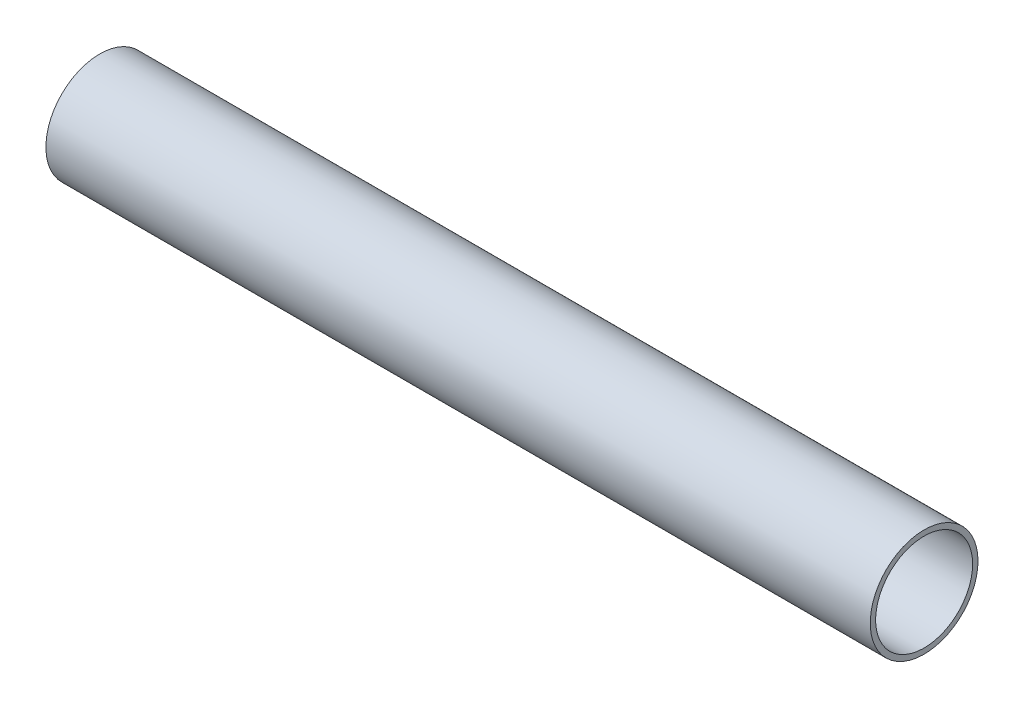
ISO-10303-21;
HEADER;
FILE_DESCRIPTION(('STEP AP214'),'2;1');
FILE_NAME('part.step','',(''),(''),'','','');
FILE_SCHEMA(('AUTOMOTIVE_DESIGN { 1 0 10303 214 1 1 1 1 }'));
ENDSEC;
DATA;
#1=APPLICATION_CONTEXT('core data for automotive mechanical design processes');
#2=APPLICATION_PROTOCOL_DEFINITION('international standard','automotive_design',2000,#1);
#3=PRODUCT_CONTEXT('',#1,'mechanical');
#4=PRODUCT('Part','Part','',(#3));
#5=PRODUCT_RELATED_PRODUCT_CATEGORY('part','',(#4));
#6=PRODUCT_DEFINITION_FORMATION('','',#4);
#7=PRODUCT_DEFINITION_CONTEXT('part definition',#1,'design');
#8=PRODUCT_DEFINITION('design','',#6,#7);
#9=PRODUCT_DEFINITION_SHAPE('','',#8);
#10=(LENGTH_UNIT() NAMED_UNIT(*) SI_UNIT(.MILLI.,.METRE.));
#11=(NAMED_UNIT(*) PLANE_ANGLE_UNIT() SI_UNIT($,.RADIAN.));
#12=(NAMED_UNIT(*) SI_UNIT($,.STERADIAN.) SOLID_ANGLE_UNIT());
#13=UNCERTAINTY_MEASURE_WITH_UNIT(LENGTH_MEASURE(1.E-05),#10,'distance_accuracy_value','');
#14=(GEOMETRIC_REPRESENTATION_CONTEXT(3) GLOBAL_UNCERTAINTY_ASSIGNED_CONTEXT((#13)) GLOBAL_UNIT_ASSIGNED_CONTEXT((#10,
#11,#12)) REPRESENTATION_CONTEXT('',''));
#15=CARTESIAN_POINT('',(0.,0.,0.));
#16=DIRECTION('',(0.,0.,1.));
#17=DIRECTION('',(1.,0.,0.));
#18=AXIS2_PLACEMENT_3D('',#15,#16,#17);
#19=CARTESIAN_POINT('',(140.019255902,0.,0.));
#20=DIRECTION('',(-1.,0.,0.));
#21=DIRECTION('',(0.,0.,1.));
#22=AXIS2_PLACEMENT_3D('',#19,#20,#21);
#23=CYLINDRICAL_SURFACE('',#22,14.2875);
#24=CARTESIAN_POINT('',(-102.8953111,0.,0.));
#25=DIRECTION('',(1.,0.,0.));
#26=DIRECTION('',(0.,0.,-1.));
#27=AXIS2_PLACEMENT_3D('',#24,#25,#26);
#28=CIRCLE('',#27,14.2875);
#29=CARTESIAN_POINT('',(-102.8953111,0.,-14.2875));
#30=VERTEX_POINT('',#29);
#31=EDGE_CURVE('E10',#30,#30,#28,.T.);
#32=ORIENTED_EDGE('',*,*,#31,.F.);
#33=EDGE_LOOP('',(#32));
#34=FACE_BOUND('',#33,.T.);
#35=CARTESIAN_POINT('',(140.019255902,0.,0.));
#36=DIRECTION('',(1.,0.,0.));
#37=DIRECTION('',(0.,0.,-1.));
#38=AXIS2_PLACEMENT_3D('',#35,#36,#37);
#39=CIRCLE('',#38,14.2875);
#40=CARTESIAN_POINT('',(140.019255902,0.,-14.2875));
#41=VERTEX_POINT('',#40);
#42=EDGE_CURVE('E54',#41,#41,#39,.T.);
#43=ORIENTED_EDGE('',*,*,#42,.T.);
#44=EDGE_LOOP('',(#43));
#45=FACE_BOUND('',#44,.T.);
#46=ADVANCED_FACE('F40',(#34,#45),#23,.F.);
#47=CARTESIAN_POINT('',(140.019255902,0.,0.));
#48=DIRECTION('',(1.,0.,0.));
#49=DIRECTION('',(0.,0.,-1.));
#50=AXIS2_PLACEMENT_3D('',#47,#48,#49);
#51=PLANE('',#50);
#52=CARTESIAN_POINT('',(140.019255902,0.,0.));
#53=DIRECTION('',(1.,0.,0.));
#54=DIRECTION('',(0.,0.,-1.));
#55=AXIS2_PLACEMENT_3D('',#52,#53,#54);
#56=CIRCLE('',#55,15.875);
#57=CARTESIAN_POINT('',(140.019255902,0.,-15.875));
#58=VERTEX_POINT('',#57);
#59=EDGE_CURVE('E51',#58,#58,#56,.T.);
#60=ORIENTED_EDGE('',*,*,#59,.T.);
#61=EDGE_LOOP('',(#60));
#62=FACE_BOUND('',#61,.T.);
#63=ORIENTED_EDGE('',*,*,#42,.F.);
#64=EDGE_LOOP('',(#63));
#65=FACE_BOUND('',#64,.T.);
#66=ADVANCED_FACE('F59',(#62,#65),#51,.T.);
#67=CARTESIAN_POINT('',(140.019255902,0.,0.));
#68=DIRECTION('',(-1.,0.,0.));
#69=DIRECTION('',(0.,0.,1.));
#70=AXIS2_PLACEMENT_3D('',#67,#68,#69);
#71=CYLINDRICAL_SURFACE('',#70,15.875);
#72=CARTESIAN_POINT('',(-102.8953111,0.,0.));
#73=DIRECTION('',(1.,0.,0.));
#74=DIRECTION('',(0.,0.,-1.));
#75=AXIS2_PLACEMENT_3D('',#72,#73,#74);
#76=CIRCLE('',#75,15.875);
#77=CARTESIAN_POINT('',(-102.8953111,0.,-15.875));
#78=VERTEX_POINT('',#77);
#79=EDGE_CURVE('E43',#78,#78,#76,.T.);
#80=ORIENTED_EDGE('',*,*,#79,.T.);
#81=EDGE_LOOP('',(#80));
#82=FACE_BOUND('',#81,.T.);
#83=ORIENTED_EDGE('',*,*,#59,.F.);
#84=EDGE_LOOP('',(#83));
#85=FACE_BOUND('',#84,.T.);
#86=ADVANCED_FACE('F61',(#82,#85),#71,.T.);
#87=CARTESIAN_POINT('',(-102.8953111,-15.875,-15.875));
#88=DIRECTION('',(1.,0.,0.));
#89=DIRECTION('',(0.,0.,-1.));
#90=AXIS2_PLACEMENT_3D('',#87,#88,#89);
#91=PLANE('',#90);
#92=ORIENTED_EDGE('',*,*,#31,.T.);
#93=EDGE_LOOP('',(#92));
#94=FACE_BOUND('',#93,.T.);
#95=ORIENTED_EDGE('',*,*,#79,.F.);
#96=EDGE_LOOP('',(#95));
#97=FACE_BOUND('',#96,.T.);
#98=ADVANCED_FACE('F68',(#94,#97),#91,.F.);
#99=CLOSED_SHELL('',(#46,#66,#86,#98));
#100=MANIFOLD_SOLID_BREP('B2',#99);
#101=ADVANCED_BREP_SHAPE_REPRESENTATION('',(#18,#100),#14);
#102=SHAPE_DEFINITION_REPRESENTATION(#9,#101);
ENDSEC;
END-ISO-10303-21;
